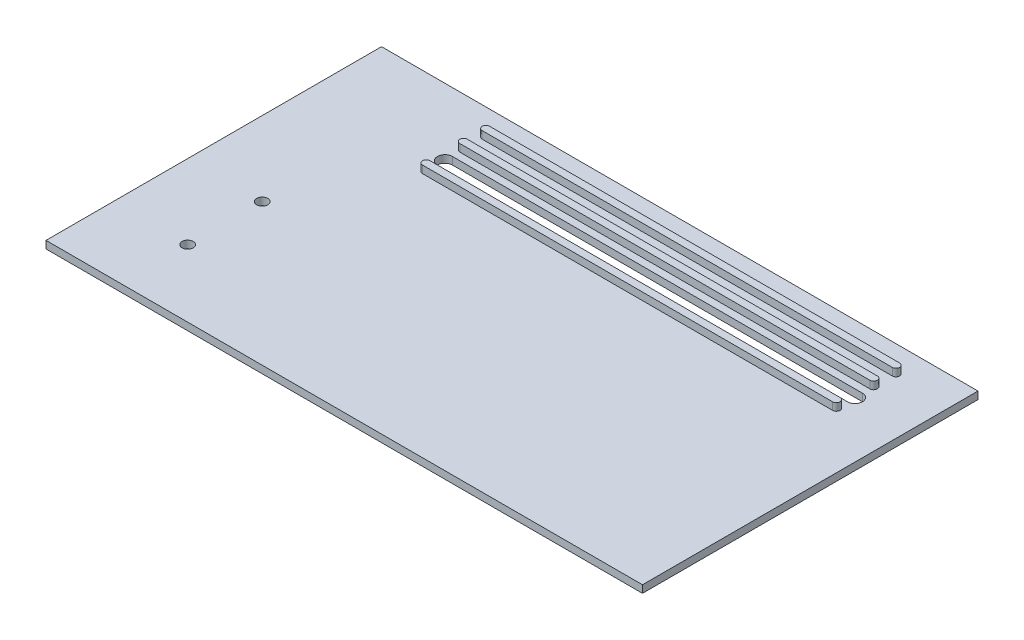
ISO-10303-21;
HEADER;
FILE_DESCRIPTION(('STEP AP214'),'2;1');
FILE_NAME('part.step','',(''),(''),'','','');
FILE_SCHEMA(('AUTOMOTIVE_DESIGN { 1 0 10303 214 1 1 1 1 }'));
ENDSEC;
DATA;
#1=APPLICATION_CONTEXT('core data for automotive mechanical design processes');
#2=APPLICATION_PROTOCOL_DEFINITION('international standard','automotive_design',2000,#1);
#3=PRODUCT_CONTEXT('',#1,'mechanical');
#4=PRODUCT('Part','Part','',(#3));
#5=PRODUCT_RELATED_PRODUCT_CATEGORY('part','',(#4));
#6=PRODUCT_DEFINITION_FORMATION('','',#4);
#7=PRODUCT_DEFINITION_CONTEXT('part definition',#1,'design');
#8=PRODUCT_DEFINITION('design','',#6,#7);
#9=PRODUCT_DEFINITION_SHAPE('','',#8);
#10=(LENGTH_UNIT() NAMED_UNIT(*) SI_UNIT(.MILLI.,.METRE.));
#11=(NAMED_UNIT(*) PLANE_ANGLE_UNIT() SI_UNIT($,.RADIAN.));
#12=(NAMED_UNIT(*) SI_UNIT($,.STERADIAN.) SOLID_ANGLE_UNIT());
#13=UNCERTAINTY_MEASURE_WITH_UNIT(LENGTH_MEASURE(1.E-05),#10,'distance_accuracy_value','');
#14=(GEOMETRIC_REPRESENTATION_CONTEXT(3) GLOBAL_UNCERTAINTY_ASSIGNED_CONTEXT((#13)) GLOBAL_UNIT_ASSIGNED_CONTEXT((#10,
#11,#12)) REPRESENTATION_CONTEXT('',''));
#15=CARTESIAN_POINT('',(0.,0.,0.));
#16=DIRECTION('',(0.,0.,1.));
#17=DIRECTION('',(1.,0.,0.));
#18=AXIS2_PLACEMENT_3D('',#15,#16,#17);
#19=CARTESIAN_POINT('',(0.,10.,0.));
#20=DIRECTION('',(0.,-1.,0.));
#21=DIRECTION('',(0.,0.,-1.));
#22=AXIS2_PLACEMENT_3D('',#19,#20,#21);
#23=PLANE('',#22);
#24=CARTESIAN_POINT('',(175.,10.,-335.));
#25=DIRECTION('',(0.,1.,0.));
#26=DIRECTION('',(0.,0.,1.));
#27=AXIS2_PLACEMENT_3D('',#24,#25,#26);
#28=CIRCLE('',#27,5.);
#29=CARTESIAN_POINT('',(175.,10.,-340.));
#30=VERTEX_POINT('',#29);
#31=CARTESIAN_POINT('',(175.,10.,-330.));
#32=VERTEX_POINT('',#31);
#33=EDGE_CURVE('E252',#30,#32,#28,.T.);
#34=ORIENTED_EDGE('',*,*,#33,.F.);
#35=DIRECTION('',(-1.,0.,0.));
#36=VECTOR('',#35,1.);
#37=CARTESIAN_POINT('',(175.,10.,-340.));
#38=LINE('',#37,#36);
#39=CARTESIAN_POINT('',(725.,10.,-340.));
#40=VERTEX_POINT('',#39);
#41=EDGE_CURVE('E239',#40,#30,#38,.T.);
#42=ORIENTED_EDGE('',*,*,#41,.F.);
#43=CARTESIAN_POINT('',(725.,10.,-335.));
#44=DIRECTION('',(0.,1.,0.));
#45=DIRECTION('',(0.,0.,1.));
#46=AXIS2_PLACEMENT_3D('',#43,#44,#45);
#47=CIRCLE('',#46,5.);
#48=CARTESIAN_POINT('',(725.,10.,-330.));
#49=VERTEX_POINT('',#48);
#50=EDGE_CURVE('E243',#49,#40,#47,.T.);
#51=ORIENTED_EDGE('',*,*,#50,.F.);
#52=DIRECTION('',(1.,0.,0.));
#53=VECTOR('',#52,1.);
#54=CARTESIAN_POINT('',(175.,10.,-330.));
#55=LINE('',#54,#53);
#56=EDGE_CURVE('E248',#32,#49,#55,.T.);
#57=ORIENTED_EDGE('',*,*,#56,.F.);
#58=EDGE_LOOP('',(#34,#42,#51,#57));
#59=FACE_BOUND('',#58,.T.);
#60=CARTESIAN_POINT('',(175.,10.,-360.));
#61=DIRECTION('',(0.,1.,0.));
#62=DIRECTION('',(0.,0.,1.));
#63=AXIS2_PLACEMENT_3D('',#60,#61,#62);
#64=CIRCLE('',#63,9.9999999999999);
#65=CARTESIAN_POINT('',(175.,10.,-370.));
#66=VERTEX_POINT('',#65);
#67=CARTESIAN_POINT('',(175.,10.,-350.));
#68=VERTEX_POINT('',#67);
#69=EDGE_CURVE('E313',#66,#68,#64,.T.);
#70=ORIENTED_EDGE('',*,*,#69,.F.);
#71=DIRECTION('',(-1.,0.,0.));
#72=VECTOR('',#71,1.);
#73=CARTESIAN_POINT('',(175.,10.,-370.));
#74=LINE('',#73,#72);
#75=CARTESIAN_POINT('',(725.,10.,-370.));
#76=VERTEX_POINT('',#75);
#77=EDGE_CURVE('E324',#76,#66,#74,.T.);
#78=ORIENTED_EDGE('',*,*,#77,.F.);
#79=CARTESIAN_POINT('',(725.,10.,-360.));
#80=DIRECTION('',(0.,1.,0.));
#81=DIRECTION('',(0.,0.,1.));
#82=AXIS2_PLACEMENT_3D('',#79,#80,#81);
#83=CIRCLE('',#82,9.9999999999999);
#84=CARTESIAN_POINT('',(725.,10.,-350.));
#85=VERTEX_POINT('',#84);
#86=EDGE_CURVE('E320',#85,#76,#83,.T.);
#87=ORIENTED_EDGE('',*,*,#86,.F.);
#88=DIRECTION('',(1.,0.,0.));
#89=VECTOR('',#88,1.);
#90=CARTESIAN_POINT('',(175.,10.,-350.));
#91=LINE('',#90,#89);
#92=EDGE_CURVE('E316',#68,#85,#91,.T.);
#93=ORIENTED_EDGE('',*,*,#92,.F.);
#94=EDGE_LOOP('',(#70,#78,#87,#93));
#95=FACE_BOUND('',#94,.T.);
#96=DIRECTION('',(0.,0.,1.));
#97=VECTOR('',#96,1.);
#98=CARTESIAN_POINT('',(0.,10.,0.));
#99=LINE('',#98,#97);
#100=CARTESIAN_POINT('',(-2.22044604925031E-13,10.,-450.));
#101=VERTEX_POINT('',#100);
#102=CARTESIAN_POINT('',(0.,10.,0.));
#103=VERTEX_POINT('',#102);
#104=EDGE_CURVE('E372',#101,#103,#99,.T.);
#105=ORIENTED_EDGE('',*,*,#104,.T.);
#106=DIRECTION('',(1.,0.,0.));
#107=VECTOR('',#106,1.);
#108=CARTESIAN_POINT('',(0.,10.,0.));
#109=LINE('',#108,#107);
#110=CARTESIAN_POINT('',(800.,10.,0.));
#111=VERTEX_POINT('',#110);
#112=EDGE_CURVE('E376',#103,#111,#109,.T.);
#113=ORIENTED_EDGE('',*,*,#112,.T.);
#114=DIRECTION('',(0.,0.,-1.));
#115=VECTOR('',#114,1.);
#116=CARTESIAN_POINT('',(800.,10.,0.));
#117=LINE('',#116,#115);
#118=CARTESIAN_POINT('',(800.,10.,-450.));
#119=VERTEX_POINT('',#118);
#120=EDGE_CURVE('E380',#111,#119,#117,.T.);
#121=ORIENTED_EDGE('',*,*,#120,.T.);
#122=DIRECTION('',(-1.,0.,0.));
#123=VECTOR('',#122,1.);
#124=CARTESIAN_POINT('',(-2.22044604925031E-13,10.,-450.));
#125=LINE('',#124,#123);
#126=EDGE_CURVE('E383',#119,#101,#125,.T.);
#127=ORIENTED_EDGE('',*,*,#126,.T.);
#128=EDGE_LOOP('',(#105,#113,#121,#127));
#129=FACE_BOUND('',#128,.T.);
#130=CARTESIAN_POINT('',(100.,10.,-190.));
#131=DIRECTION('',(0.,1.,0.));
#132=DIRECTION('',(0.,0.,1.));
#133=AXIS2_PLACEMENT_3D('',#130,#131,#132);
#134=CIRCLE('',#133,7.50000000000001);
#135=CARTESIAN_POINT('',(100.,10.,-182.5));
#136=VERTEX_POINT('',#135);
#137=EDGE_CURVE('E364',#136,#136,#134,.T.);
#138=ORIENTED_EDGE('',*,*,#137,.F.);
#139=EDGE_LOOP('',(#138));
#140=FACE_BOUND('',#139,.T.);
#141=CARTESIAN_POINT('',(100.,10.,-90.));
#142=DIRECTION('',(0.,1.,0.));
#143=DIRECTION('',(0.,0.,1.));
#144=AXIS2_PLACEMENT_3D('',#141,#142,#143);
#145=CIRCLE('',#144,7.50000000000001);
#146=CARTESIAN_POINT('',(100.,10.,-82.5));
#147=VERTEX_POINT('',#146);
#148=EDGE_CURVE('E356',#147,#147,#145,.T.);
#149=ORIENTED_EDGE('',*,*,#148,.F.);
#150=EDGE_LOOP('',(#149));
#151=FACE_BOUND('',#150,.T.);
#152=CARTESIAN_POINT('',(175.,10.,-385.));
#153=DIRECTION('',(0.,1.,0.));
#154=DIRECTION('',(0.,0.,1.));
#155=AXIS2_PLACEMENT_3D('',#152,#153,#154);
#156=CIRCLE('',#155,5.);
#157=CARTESIAN_POINT('',(175.,10.,-390.));
#158=VERTEX_POINT('',#157);
#159=CARTESIAN_POINT('',(175.,10.,-380.));
#160=VERTEX_POINT('',#159);
#161=EDGE_CURVE('E256',#158,#160,#156,.T.);
#162=ORIENTED_EDGE('',*,*,#161,.F.);
#163=DIRECTION('',(-1.,0.,0.));
#164=VECTOR('',#163,1.);
#165=CARTESIAN_POINT('',(175.,10.,-390.));
#166=LINE('',#165,#164);
#167=CARTESIAN_POINT('',(725.,10.,-390.));
#168=VERTEX_POINT('',#167);
#169=EDGE_CURVE('E273',#168,#158,#166,.T.);
#170=ORIENTED_EDGE('',*,*,#169,.F.);
#171=CARTESIAN_POINT('',(725.,10.,-385.));
#172=DIRECTION('',(0.,1.,0.));
#173=DIRECTION('',(0.,0.,1.));
#174=AXIS2_PLACEMENT_3D('',#171,#172,#173);
#175=CIRCLE('',#174,5.);
#176=CARTESIAN_POINT('',(725.,10.,-380.));
#177=VERTEX_POINT('',#176);
#178=EDGE_CURVE('E290',#177,#168,#175,.T.);
#179=ORIENTED_EDGE('',*,*,#178,.F.);
#180=DIRECTION('',(1.,0.,0.));
#181=VECTOR('',#180,1.);
#182=CARTESIAN_POINT('',(175.,10.,-380.));
#183=LINE('',#182,#181);
#184=EDGE_CURVE('E286',#160,#177,#183,.T.);
#185=ORIENTED_EDGE('',*,*,#184,.F.);
#186=EDGE_LOOP('',(#162,#170,#179,#185));
#187=FACE_BOUND('',#186,.T.);
#188=CARTESIAN_POINT('',(175.,10.,-415.));
#189=DIRECTION('',(0.,1.,0.));
#190=DIRECTION('',(0.,0.,1.));
#191=AXIS2_PLACEMENT_3D('',#188,#189,#190);
#192=CIRCLE('',#191,5.);
#193=CARTESIAN_POINT('',(175.,10.,-420.));
#194=VERTEX_POINT('',#193);
#195=CARTESIAN_POINT('',(175.,10.,-410.));
#196=VERTEX_POINT('',#195);
#197=EDGE_CURVE('E178',#194,#196,#192,.T.);
#198=ORIENTED_EDGE('',*,*,#197,.F.);
#199=DIRECTION('',(-1.,0.,0.));
#200=VECTOR('',#199,1.);
#201=CARTESIAN_POINT('',(175.,10.,-420.));
#202=LINE('',#201,#200);
#203=CARTESIAN_POINT('',(725.,10.,-420.));
#204=VERTEX_POINT('',#203);
#205=EDGE_CURVE('E180',#204,#194,#202,.T.);
#206=ORIENTED_EDGE('',*,*,#205,.F.);
#207=CARTESIAN_POINT('',(725.,10.,-415.));
#208=DIRECTION('',(0.,1.,0.));
#209=DIRECTION('',(0.,0.,1.));
#210=AXIS2_PLACEMENT_3D('',#207,#208,#209);
#211=CIRCLE('',#210,5.);
#212=CARTESIAN_POINT('',(725.,10.,-410.));
#213=VERTEX_POINT('',#212);
#214=EDGE_CURVE('E65',#213,#204,#211,.T.);
#215=ORIENTED_EDGE('',*,*,#214,.F.);
#216=DIRECTION('',(1.,0.,0.));
#217=VECTOR('',#216,1.);
#218=CARTESIAN_POINT('',(175.,10.,-410.));
#219=LINE('',#218,#217);
#220=EDGE_CURVE('E60',#196,#213,#219,.T.);
#221=ORIENTED_EDGE('',*,*,#220,.F.);
#222=EDGE_LOOP('',(#198,#206,#215,#221));
#223=FACE_BOUND('',#222,.T.);
#224=ADVANCED_FACE('F44',(#59,#95,#129,#140,#151,#187,#223),#23,.F.);
#225=CARTESIAN_POINT('',(0.,0.,0.));
#226=DIRECTION('',(0.,-1.,0.));
#227=DIRECTION('',(0.,0.,-1.));
#228=AXIS2_PLACEMENT_3D('',#225,#226,#227);
#229=PLANE('',#228);
#230=CARTESIAN_POINT('',(100.,0.,-190.));
#231=DIRECTION('',(0.,1.,0.));
#232=DIRECTION('',(0.,0.,1.));
#233=AXIS2_PLACEMENT_3D('',#230,#231,#232);
#234=CIRCLE('',#233,7.50000000000001);
#235=CARTESIAN_POINT('',(100.,0.,-182.5));
#236=VERTEX_POINT('',#235);
#237=EDGE_CURVE('E360',#236,#236,#234,.T.);
#238=ORIENTED_EDGE('',*,*,#237,.T.);
#239=EDGE_LOOP('',(#238));
#240=FACE_BOUND('',#239,.T.);
#241=DIRECTION('',(0.,0.,1.));
#242=VECTOR('',#241,1.);
#243=CARTESIAN_POINT('',(0.,0.,0.));
#244=LINE('',#243,#242);
#245=CARTESIAN_POINT('',(-2.22044604925031E-13,0.,-450.));
#246=VERTEX_POINT('',#245);
#247=CARTESIAN_POINT('',(0.,0.,0.));
#248=VERTEX_POINT('',#247);
#249=EDGE_CURVE('E368',#246,#248,#244,.T.);
#250=ORIENTED_EDGE('',*,*,#249,.F.);
#251=DIRECTION('',(-1.,0.,0.));
#252=VECTOR('',#251,1.);
#253=CARTESIAN_POINT('',(-2.22044604925031E-13,0.,-450.));
#254=LINE('',#253,#252);
#255=CARTESIAN_POINT('',(800.,0.,-450.));
#256=VERTEX_POINT('',#255);
#257=EDGE_CURVE('E377',#256,#246,#254,.T.);
#258=ORIENTED_EDGE('',*,*,#257,.F.);
#259=DIRECTION('',(0.,0.,-1.));
#260=VECTOR('',#259,1.);
#261=CARTESIAN_POINT('',(800.,0.,0.));
#262=LINE('',#261,#260);
#263=CARTESIAN_POINT('',(800.,0.,0.));
#264=VERTEX_POINT('',#263);
#265=EDGE_CURVE('E393',#264,#256,#262,.T.);
#266=ORIENTED_EDGE('',*,*,#265,.F.);
#267=DIRECTION('',(1.,0.,0.));
#268=VECTOR('',#267,1.);
#269=CARTESIAN_POINT('',(0.,0.,0.));
#270=LINE('',#269,#268);
#271=EDGE_CURVE('E390',#248,#264,#270,.T.);
#272=ORIENTED_EDGE('',*,*,#271,.F.);
#273=EDGE_LOOP('',(#250,#258,#266,#272));
#274=FACE_BOUND('',#273,.T.);
#275=CARTESIAN_POINT('',(100.,0.,-90.));
#276=DIRECTION('',(0.,1.,0.));
#277=DIRECTION('',(0.,0.,1.));
#278=AXIS2_PLACEMENT_3D('',#275,#276,#277);
#279=CIRCLE('',#278,7.50000000000001);
#280=CARTESIAN_POINT('',(100.,0.,-82.5));
#281=VERTEX_POINT('',#280);
#282=EDGE_CURVE('E355',#281,#281,#279,.T.);
#283=ORIENTED_EDGE('',*,*,#282,.T.);
#284=EDGE_LOOP('',(#283));
#285=FACE_BOUND('',#284,.T.);
#286=DIRECTION('',(-1.,0.,0.));
#287=VECTOR('',#286,1.);
#288=CARTESIAN_POINT('',(175.,0.,-370.));
#289=LINE('',#288,#287);
#290=CARTESIAN_POINT('',(725.,0.,-370.));
#291=VERTEX_POINT('',#290);
#292=CARTESIAN_POINT('',(175.,0.,-370.));
#293=VERTEX_POINT('',#292);
#294=EDGE_CURVE('E317',#291,#293,#289,.T.);
#295=ORIENTED_EDGE('',*,*,#294,.T.);
#296=CARTESIAN_POINT('',(175.,0.,-360.));
#297=DIRECTION('',(0.,1.,0.));
#298=DIRECTION('',(0.,0.,1.));
#299=AXIS2_PLACEMENT_3D('',#296,#297,#298);
#300=CIRCLE('',#299,9.9999999999999);
#301=CARTESIAN_POINT('',(175.,0.,-350.));
#302=VERTEX_POINT('',#301);
#303=EDGE_CURVE('E312',#293,#302,#300,.T.);
#304=ORIENTED_EDGE('',*,*,#303,.T.);
#305=DIRECTION('',(1.,0.,0.));
#306=VECTOR('',#305,1.);
#307=CARTESIAN_POINT('',(175.,0.,-350.));
#308=LINE('',#307,#306);
#309=CARTESIAN_POINT('',(725.,0.,-350.));
#310=VERTEX_POINT('',#309);
#311=EDGE_CURVE('E331',#302,#310,#308,.T.);
#312=ORIENTED_EDGE('',*,*,#311,.T.);
#313=CARTESIAN_POINT('',(725.,0.,-360.));
#314=DIRECTION('',(0.,1.,0.));
#315=DIRECTION('',(0.,0.,1.));
#316=AXIS2_PLACEMENT_3D('',#313,#314,#315);
#317=CIRCLE('',#316,9.9999999999999);
#318=EDGE_CURVE('E335',#310,#291,#317,.T.);
#319=ORIENTED_EDGE('',*,*,#318,.T.);
#320=EDGE_LOOP('',(#295,#304,#312,#319));
#321=FACE_BOUND('',#320,.T.);
#322=ADVANCED_FACE('F416',(#240,#274,#285,#321),#229,.T.);
#323=CARTESIAN_POINT('',(0.,10.,0.));
#324=DIRECTION('',(1.,0.,0.));
#325=DIRECTION('',(0.,0.,-1.));
#326=AXIS2_PLACEMENT_3D('',#323,#324,#325);
#327=PLANE('',#326);
#328=ORIENTED_EDGE('',*,*,#249,.T.);
#329=DIRECTION('',(0.,-1.,0.));
#330=VECTOR('',#329,1.);
#331=CARTESIAN_POINT('',(0.,10.,0.));
#332=LINE('',#331,#330);
#333=EDGE_CURVE('E11',#103,#248,#332,.T.);
#334=ORIENTED_EDGE('',*,*,#333,.F.);
#335=ORIENTED_EDGE('',*,*,#104,.F.);
#336=DIRECTION('',(0.,-1.,0.));
#337=VECTOR('',#336,1.);
#338=CARTESIAN_POINT('',(-2.22044604925031E-13,10.,-450.));
#339=LINE('',#338,#337);
#340=EDGE_CURVE('E386',#101,#246,#339,.T.);
#341=ORIENTED_EDGE('',*,*,#340,.T.);
#342=EDGE_LOOP('',(#328,#334,#335,#341));
#343=FACE_BOUND('',#342,.T.);
#344=ADVANCED_FACE('F46',(#343),#327,.F.);
#345=CARTESIAN_POINT('',(0.,10.,0.));
#346=DIRECTION('',(0.,0.,-1.));
#347=DIRECTION('',(-1.,0.,0.));
#348=AXIS2_PLACEMENT_3D('',#345,#346,#347);
#349=PLANE('',#348);
#350=ORIENTED_EDGE('',*,*,#271,.T.);
#351=DIRECTION('',(0.,-1.,0.));
#352=VECTOR('',#351,1.);
#353=CARTESIAN_POINT('',(800.,10.,0.));
#354=LINE('',#353,#352);
#355=EDGE_CURVE('E53',#111,#264,#354,.T.);
#356=ORIENTED_EDGE('',*,*,#355,.F.);
#357=ORIENTED_EDGE('',*,*,#112,.F.);
#358=ORIENTED_EDGE('',*,*,#333,.T.);
#359=EDGE_LOOP('',(#350,#356,#357,#358));
#360=FACE_BOUND('',#359,.T.);
#361=ADVANCED_FACE('F427',(#360),#349,.F.);
#362=CARTESIAN_POINT('',(800.,10.,0.));
#363=DIRECTION('',(-1.,0.,0.));
#364=DIRECTION('',(0.,0.,1.));
#365=AXIS2_PLACEMENT_3D('',#362,#363,#364);
#366=PLANE('',#365);
#367=ORIENTED_EDGE('',*,*,#265,.T.);
#368=DIRECTION('',(0.,-1.,0.));
#369=VECTOR('',#368,1.);
#370=CARTESIAN_POINT('',(800.,10.,-450.));
#371=LINE('',#370,#369);
#372=EDGE_CURVE('E401',#119,#256,#371,.T.);
#373=ORIENTED_EDGE('',*,*,#372,.F.);
#374=ORIENTED_EDGE('',*,*,#120,.F.);
#375=ORIENTED_EDGE('',*,*,#355,.T.);
#376=EDGE_LOOP('',(#367,#373,#374,#375));
#377=FACE_BOUND('',#376,.T.);
#378=ADVANCED_FACE('F410',(#377),#366,.F.);
#379=CARTESIAN_POINT('',(-2.22044604925031E-13,10.,-450.));
#380=DIRECTION('',(0.,0.,1.));
#381=DIRECTION('',(1.,0.,0.));
#382=AXIS2_PLACEMENT_3D('',#379,#380,#381);
#383=PLANE('',#382);
#384=ORIENTED_EDGE('',*,*,#257,.T.);
#385=ORIENTED_EDGE('',*,*,#340,.F.);
#386=ORIENTED_EDGE('',*,*,#126,.F.);
#387=ORIENTED_EDGE('',*,*,#372,.T.);
#388=EDGE_LOOP('',(#384,#385,#386,#387));
#389=FACE_BOUND('',#388,.T.);
#390=ADVANCED_FACE('F420',(#389),#383,.F.);
#391=CARTESIAN_POINT('',(100.,10.,-190.));
#392=DIRECTION('',(0.,-1.,0.));
#393=DIRECTION('',(0.,0.,-1.));
#394=AXIS2_PLACEMENT_3D('',#391,#392,#393);
#395=CYLINDRICAL_SURFACE('',#394,7.50000000000001);
#396=ORIENTED_EDGE('',*,*,#137,.T.);
#397=EDGE_LOOP('',(#396));
#398=FACE_BOUND('',#397,.T.);
#399=ORIENTED_EDGE('',*,*,#237,.F.);
#400=EDGE_LOOP('',(#399));
#401=FACE_BOUND('',#400,.T.);
#402=ADVANCED_FACE('F444',(#398,#401),#395,.F.);
#403=CARTESIAN_POINT('',(100.,10.,-90.));
#404=DIRECTION('',(0.,-1.,0.));
#405=DIRECTION('',(0.,0.,-1.));
#406=AXIS2_PLACEMENT_3D('',#403,#404,#405);
#407=CYLINDRICAL_SURFACE('',#406,7.50000000000001);
#408=ORIENTED_EDGE('',*,*,#148,.T.);
#409=EDGE_LOOP('',(#408));
#410=FACE_BOUND('',#409,.T.);
#411=ORIENTED_EDGE('',*,*,#282,.F.);
#412=EDGE_LOOP('',(#411));
#413=FACE_BOUND('',#412,.T.);
#414=ADVANCED_FACE('F451',(#410,#413),#407,.F.);
#415=CARTESIAN_POINT('',(175.,10.,-360.));
#416=DIRECTION('',(0.,-1.,0.));
#417=DIRECTION('',(0.,0.,-1.));
#418=AXIS2_PLACEMENT_3D('',#415,#416,#417);
#419=CYLINDRICAL_SURFACE('',#418,9.9999999999999);
#420=ORIENTED_EDGE('',*,*,#303,.F.);
#421=DIRECTION('',(0.,-1.,0.));
#422=VECTOR('',#421,1.);
#423=CARTESIAN_POINT('',(175.,10.,-370.));
#424=LINE('',#423,#422);
#425=EDGE_CURVE('E327',#66,#293,#424,.T.);
#426=ORIENTED_EDGE('',*,*,#425,.F.);
#427=ORIENTED_EDGE('',*,*,#69,.T.);
#428=DIRECTION('',(0.,-1.,0.));
#429=VECTOR('',#428,1.);
#430=CARTESIAN_POINT('',(175.,10.,-350.));
#431=LINE('',#430,#429);
#432=EDGE_CURVE('E351',#68,#302,#431,.T.);
#433=ORIENTED_EDGE('',*,*,#432,.T.);
#434=EDGE_LOOP('',(#420,#426,#427,#433));
#435=FACE_BOUND('',#434,.T.);
#436=ADVANCED_FACE('F456',(#435),#419,.F.);
#437=CARTESIAN_POINT('',(175.,10.,-350.));
#438=DIRECTION('',(0.,0.,-1.));
#439=DIRECTION('',(-1.,0.,0.));
#440=AXIS2_PLACEMENT_3D('',#437,#438,#439);
#441=PLANE('',#440);
#442=ORIENTED_EDGE('',*,*,#311,.F.);
#443=ORIENTED_EDGE('',*,*,#432,.F.);
#444=ORIENTED_EDGE('',*,*,#92,.T.);
#445=DIRECTION('',(0.,-1.,0.));
#446=VECTOR('',#445,1.);
#447=CARTESIAN_POINT('',(725.,10.,-350.));
#448=LINE('',#447,#446);
#449=EDGE_CURVE('E348',#85,#310,#448,.T.);
#450=ORIENTED_EDGE('',*,*,#449,.T.);
#451=EDGE_LOOP('',(#442,#443,#444,#450));
#452=FACE_BOUND('',#451,.T.);
#453=ADVANCED_FACE('F498',(#452),#441,.T.);
#454=CARTESIAN_POINT('',(725.,10.,-360.));
#455=DIRECTION('',(0.,-1.,0.));
#456=DIRECTION('',(0.,0.,-1.));
#457=AXIS2_PLACEMENT_3D('',#454,#455,#456);
#458=CYLINDRICAL_SURFACE('',#457,9.9999999999999);
#459=ORIENTED_EDGE('',*,*,#318,.F.);
#460=ORIENTED_EDGE('',*,*,#449,.F.);
#461=ORIENTED_EDGE('',*,*,#86,.T.);
#462=DIRECTION('',(0.,-1.,0.));
#463=VECTOR('',#462,1.);
#464=CARTESIAN_POINT('',(725.,10.,-370.));
#465=LINE('',#464,#463);
#466=EDGE_CURVE('E345',#76,#291,#465,.T.);
#467=ORIENTED_EDGE('',*,*,#466,.T.);
#468=EDGE_LOOP('',(#459,#460,#461,#467));
#469=FACE_BOUND('',#468,.T.);
#470=ADVANCED_FACE('F494',(#469),#458,.F.);
#471=CARTESIAN_POINT('',(175.,10.,-370.));
#472=DIRECTION('',(0.,0.,1.));
#473=DIRECTION('',(1.,0.,0.));
#474=AXIS2_PLACEMENT_3D('',#471,#472,#473);
#475=PLANE('',#474);
#476=ORIENTED_EDGE('',*,*,#294,.F.);
#477=ORIENTED_EDGE('',*,*,#466,.F.);
#478=ORIENTED_EDGE('',*,*,#77,.T.);
#479=ORIENTED_EDGE('',*,*,#425,.T.);
#480=EDGE_LOOP('',(#476,#477,#478,#479));
#481=FACE_BOUND('',#480,.T.);
#482=ADVANCED_FACE('F488',(#481),#475,.T.);
#483=CARTESIAN_POINT('',(175.,20.,-385.));
#484=DIRECTION('',(0.,-1.,0.));
#485=DIRECTION('',(0.,0.,-1.));
#486=AXIS2_PLACEMENT_3D('',#483,#484,#485);
#487=CYLINDRICAL_SURFACE('',#486,5.);
#488=ORIENTED_EDGE('',*,*,#161,.T.);
#489=DIRECTION('',(0.,-1.,0.));
#490=VECTOR('',#489,1.);
#491=CARTESIAN_POINT('',(175.,20.,-380.));
#492=LINE('',#491,#490);
#493=CARTESIAN_POINT('',(175.,20.,-380.));
#494=VERTEX_POINT('',#493);
#495=EDGE_CURVE('E308',#494,#160,#492,.T.);
#496=ORIENTED_EDGE('',*,*,#495,.F.);
#497=CARTESIAN_POINT('',(175.,20.,-385.));
#498=DIRECTION('',(0.,1.,0.));
#499=DIRECTION('',(0.,0.,1.));
#500=AXIS2_PLACEMENT_3D('',#497,#498,#499);
#501=CIRCLE('',#500,5.);
#502=CARTESIAN_POINT('',(175.,20.,-390.));
#503=VERTEX_POINT('',#502);
#504=EDGE_CURVE('E268',#503,#494,#501,.T.);
#505=ORIENTED_EDGE('',*,*,#504,.F.);
#506=DIRECTION('',(0.,-1.,0.));
#507=VECTOR('',#506,1.);
#508=CARTESIAN_POINT('',(175.,20.,-390.));
#509=LINE('',#508,#507);
#510=EDGE_CURVE('E282',#503,#158,#509,.T.);
#511=ORIENTED_EDGE('',*,*,#510,.T.);
#512=EDGE_LOOP('',(#488,#496,#505,#511));
#513=FACE_BOUND('',#512,.T.);
#514=ADVANCED_FACE('F472',(#513),#487,.T.);
#515=CARTESIAN_POINT('',(175.,20.,-380.));
#516=DIRECTION('',(0.,0.,-1.));
#517=DIRECTION('',(-1.,0.,0.));
#518=AXIS2_PLACEMENT_3D('',#515,#516,#517);
#519=PLANE('',#518);
#520=ORIENTED_EDGE('',*,*,#184,.T.);
#521=DIRECTION('',(0.,-1.,0.));
#522=VECTOR('',#521,1.);
#523=CARTESIAN_POINT('',(725.,20.,-380.));
#524=LINE('',#523,#522);
#525=CARTESIAN_POINT('',(725.,20.,-380.));
#526=VERTEX_POINT('',#525);
#527=EDGE_CURVE('E304',#526,#177,#524,.T.);
#528=ORIENTED_EDGE('',*,*,#527,.F.);
#529=DIRECTION('',(1.,0.,0.));
#530=VECTOR('',#529,1.);
#531=CARTESIAN_POINT('',(175.,20.,-380.));
#532=LINE('',#531,#530);
#533=EDGE_CURVE('E272',#494,#526,#532,.T.);
#534=ORIENTED_EDGE('',*,*,#533,.F.);
#535=ORIENTED_EDGE('',*,*,#495,.T.);
#536=EDGE_LOOP('',(#520,#528,#534,#535));
#537=FACE_BOUND('',#536,.T.);
#538=ADVANCED_FACE('F480',(#537),#519,.F.);
#539=CARTESIAN_POINT('',(725.,20.,-385.));
#540=DIRECTION('',(0.,-1.,0.));
#541=DIRECTION('',(0.,0.,-1.));
#542=AXIS2_PLACEMENT_3D('',#539,#540,#541);
#543=CYLINDRICAL_SURFACE('',#542,5.);
#544=ORIENTED_EDGE('',*,*,#178,.T.);
#545=DIRECTION('',(0.,-1.,0.));
#546=VECTOR('',#545,1.);
#547=CARTESIAN_POINT('',(725.,20.,-390.));
#548=LINE('',#547,#546);
#549=CARTESIAN_POINT('',(725.,20.,-390.));
#550=VERTEX_POINT('',#549);
#551=EDGE_CURVE('E300',#550,#168,#548,.T.);
#552=ORIENTED_EDGE('',*,*,#551,.F.);
#553=CARTESIAN_POINT('',(725.,20.,-385.));
#554=DIRECTION('',(0.,1.,0.));
#555=DIRECTION('',(0.,0.,1.));
#556=AXIS2_PLACEMENT_3D('',#553,#554,#555);
#557=CIRCLE('',#556,5.);
#558=EDGE_CURVE('E276',#526,#550,#557,.T.);
#559=ORIENTED_EDGE('',*,*,#558,.F.);
#560=ORIENTED_EDGE('',*,*,#527,.T.);
#561=EDGE_LOOP('',(#544,#552,#559,#560));
#562=FACE_BOUND('',#561,.T.);
#563=ADVANCED_FACE('F478',(#562),#543,.T.);
#564=CARTESIAN_POINT('',(175.,20.,-390.));
#565=DIRECTION('',(0.,0.,1.));
#566=DIRECTION('',(1.,0.,0.));
#567=AXIS2_PLACEMENT_3D('',#564,#565,#566);
#568=PLANE('',#567);
#569=ORIENTED_EDGE('',*,*,#169,.T.);
#570=ORIENTED_EDGE('',*,*,#510,.F.);
#571=DIRECTION('',(-1.,0.,0.));
#572=VECTOR('',#571,1.);
#573=CARTESIAN_POINT('',(175.,20.,-390.));
#574=LINE('',#573,#572);
#575=EDGE_CURVE('E279',#550,#503,#574,.T.);
#576=ORIENTED_EDGE('',*,*,#575,.F.);
#577=ORIENTED_EDGE('',*,*,#551,.T.);
#578=EDGE_LOOP('',(#569,#570,#576,#577));
#579=FACE_BOUND('',#578,.T.);
#580=ADVANCED_FACE('F468',(#579),#568,.F.);
#581=CARTESIAN_POINT('',(175.,20.,-385.));
#582=DIRECTION('',(0.,1.,0.));
#583=DIRECTION('',(0.,0.,1.));
#584=AXIS2_PLACEMENT_3D('',#581,#582,#583);
#585=PLANE('',#584);
#586=ORIENTED_EDGE('',*,*,#504,.T.);
#587=ORIENTED_EDGE('',*,*,#533,.T.);
#588=ORIENTED_EDGE('',*,*,#558,.T.);
#589=ORIENTED_EDGE('',*,*,#575,.T.);
#590=EDGE_LOOP('',(#586,#587,#588,#589));
#591=FACE_BOUND('',#590,.T.);
#592=ADVANCED_FACE('F474',(#591),#585,.T.);
#593=CARTESIAN_POINT('',(175.,20.,-335.));
#594=DIRECTION('',(0.,-1.,0.));
#595=DIRECTION('',(0.,0.,-1.));
#596=AXIS2_PLACEMENT_3D('',#593,#594,#595);
#597=CYLINDRICAL_SURFACE('',#596,5.);
#598=ORIENTED_EDGE('',*,*,#33,.T.);
#599=DIRECTION('',(0.,-1.,0.));
#600=VECTOR('',#599,1.);
#601=CARTESIAN_POINT('',(175.,20.,-330.));
#602=LINE('',#601,#600);
#603=CARTESIAN_POINT('',(175.,20.,-330.));
#604=VERTEX_POINT('',#603);
#605=EDGE_CURVE('E185',#604,#32,#602,.T.);
#606=ORIENTED_EDGE('',*,*,#605,.F.);
#607=CARTESIAN_POINT('',(175.,20.,-335.));
#608=DIRECTION('',(0.,1.,0.));
#609=DIRECTION('',(0.,0.,1.));
#610=AXIS2_PLACEMENT_3D('',#607,#608,#609);
#611=CIRCLE('',#610,5.);
#612=CARTESIAN_POINT('',(175.,20.,-340.));
#613=VERTEX_POINT('',#612);
#614=EDGE_CURVE('E244',#613,#604,#611,.T.);
#615=ORIENTED_EDGE('',*,*,#614,.F.);
#616=DIRECTION('',(0.,-1.,0.));
#617=VECTOR('',#616,1.);
#618=CARTESIAN_POINT('',(175.,20.,-340.));
#619=LINE('',#618,#617);
#620=EDGE_CURVE('E234',#613,#30,#619,.T.);
#621=ORIENTED_EDGE('',*,*,#620,.T.);
#622=EDGE_LOOP('',(#598,#606,#615,#621));
#623=FACE_BOUND('',#622,.T.);
#624=ADVANCED_FACE('F568',(#623),#597,.T.);
#625=CARTESIAN_POINT('',(175.,20.,-330.));
#626=DIRECTION('',(0.,0.,-1.));
#627=DIRECTION('',(-1.,0.,0.));
#628=AXIS2_PLACEMENT_3D('',#625,#626,#627);
#629=PLANE('',#628);
#630=ORIENTED_EDGE('',*,*,#56,.T.);
#631=DIRECTION('',(0.,-1.,0.));
#632=VECTOR('',#631,1.);
#633=CARTESIAN_POINT('',(725.,20.,-330.));
#634=LINE('',#633,#632);
#635=CARTESIAN_POINT('',(725.,20.,-330.));
#636=VERTEX_POINT('',#635);
#637=EDGE_CURVE('E226',#636,#49,#634,.T.);
#638=ORIENTED_EDGE('',*,*,#637,.F.);
#639=DIRECTION('',(1.,0.,0.));
#640=VECTOR('',#639,1.);
#641=CARTESIAN_POINT('',(175.,20.,-330.));
#642=LINE('',#641,#640);
#643=EDGE_CURVE('E262',#604,#636,#642,.T.);
#644=ORIENTED_EDGE('',*,*,#643,.F.);
#645=ORIENTED_EDGE('',*,*,#605,.T.);
#646=EDGE_LOOP('',(#630,#638,#644,#645));
#647=FACE_BOUND('',#646,.T.);
#648=ADVANCED_FACE('F578',(#647),#629,.F.);
#649=CARTESIAN_POINT('',(725.,20.,-335.));
#650=DIRECTION('',(0.,-1.,0.));
#651=DIRECTION('',(0.,0.,-1.));
#652=AXIS2_PLACEMENT_3D('',#649,#650,#651);
#653=CYLINDRICAL_SURFACE('',#652,5.);
#654=ORIENTED_EDGE('',*,*,#50,.T.);
#655=DIRECTION('',(0.,-1.,0.));
#656=VECTOR('',#655,1.);
#657=CARTESIAN_POINT('',(725.,20.,-340.));
#658=LINE('',#657,#656);
#659=CARTESIAN_POINT('',(725.,20.,-340.));
#660=VERTEX_POINT('',#659);
#661=EDGE_CURVE('E230',#660,#40,#658,.T.);
#662=ORIENTED_EDGE('',*,*,#661,.F.);
#663=CARTESIAN_POINT('',(725.,20.,-335.));
#664=DIRECTION('',(0.,1.,0.));
#665=DIRECTION('',(0.,0.,1.));
#666=AXIS2_PLACEMENT_3D('',#663,#664,#665);
#667=CIRCLE('',#666,5.);
#668=EDGE_CURVE('E259',#636,#660,#667,.T.);
#669=ORIENTED_EDGE('',*,*,#668,.F.);
#670=ORIENTED_EDGE('',*,*,#637,.T.);
#671=EDGE_LOOP('',(#654,#662,#669,#670));
#672=FACE_BOUND('',#671,.T.);
#673=ADVANCED_FACE('F589',(#672),#653,.T.);
#674=CARTESIAN_POINT('',(175.,20.,-340.));
#675=DIRECTION('',(0.,0.,1.));
#676=DIRECTION('',(1.,0.,0.));
#677=AXIS2_PLACEMENT_3D('',#674,#675,#676);
#678=PLANE('',#677);
#679=ORIENTED_EDGE('',*,*,#41,.T.);
#680=ORIENTED_EDGE('',*,*,#620,.F.);
#681=DIRECTION('',(-1.,0.,0.));
#682=VECTOR('',#681,1.);
#683=CARTESIAN_POINT('',(175.,20.,-340.));
#684=LINE('',#683,#682);
#685=EDGE_CURVE('E238',#660,#613,#684,.T.);
#686=ORIENTED_EDGE('',*,*,#685,.F.);
#687=ORIENTED_EDGE('',*,*,#661,.T.);
#688=EDGE_LOOP('',(#679,#680,#686,#687));
#689=FACE_BOUND('',#688,.T.);
#690=ADVANCED_FACE('F600',(#689),#678,.F.);
#691=CARTESIAN_POINT('',(175.,20.,-335.));
#692=DIRECTION('',(0.,1.,0.));
#693=DIRECTION('',(0.,0.,1.));
#694=AXIS2_PLACEMENT_3D('',#691,#692,#693);
#695=PLANE('',#694);
#696=ORIENTED_EDGE('',*,*,#614,.T.);
#697=ORIENTED_EDGE('',*,*,#643,.T.);
#698=ORIENTED_EDGE('',*,*,#668,.T.);
#699=ORIENTED_EDGE('',*,*,#685,.T.);
#700=EDGE_LOOP('',(#696,#697,#698,#699));
#701=FACE_BOUND('',#700,.T.);
#702=ADVANCED_FACE('F611',(#701),#695,.T.);
#703=CARTESIAN_POINT('',(175.,20.,-415.));
#704=DIRECTION('',(0.,-1.,0.));
#705=DIRECTION('',(0.,0.,-1.));
#706=AXIS2_PLACEMENT_3D('',#703,#704,#705);
#707=CYLINDRICAL_SURFACE('',#706,5.);
#708=ORIENTED_EDGE('',*,*,#197,.T.);
#709=DIRECTION('',(0.,-1.,0.));
#710=VECTOR('',#709,1.);
#711=CARTESIAN_POINT('',(175.,20.,-410.));
#712=LINE('',#711,#710);
#713=CARTESIAN_POINT('',(175.,20.,-410.));
#714=VERTEX_POINT('',#713);
#715=EDGE_CURVE('E761',#714,#196,#712,.T.);
#716=ORIENTED_EDGE('',*,*,#715,.F.);
#717=CARTESIAN_POINT('',(175.,20.,-415.));
#718=DIRECTION('',(0.,1.,0.));
#719=DIRECTION('',(0.,0.,1.));
#720=AXIS2_PLACEMENT_3D('',#717,#718,#719);
#721=CIRCLE('',#720,5.);
#722=CARTESIAN_POINT('',(175.,20.,-420.));
#723=VERTEX_POINT('',#722);
#724=EDGE_CURVE('E197',#723,#714,#721,.T.);
#725=ORIENTED_EDGE('',*,*,#724,.F.);
#726=DIRECTION('',(0.,-1.,0.));
#727=VECTOR('',#726,1.);
#728=CARTESIAN_POINT('',(175.,20.,-420.));
#729=LINE('',#728,#727);
#730=EDGE_CURVE('E192',#723,#194,#729,.T.);
#731=ORIENTED_EDGE('',*,*,#730,.T.);
#732=EDGE_LOOP('',(#708,#716,#725,#731));
#733=FACE_BOUND('',#732,.T.);
#734=ADVANCED_FACE('F199',(#733),#707,.T.);
#735=CARTESIAN_POINT('',(175.,20.,-410.));
#736=DIRECTION('',(0.,0.,-1.));
#737=DIRECTION('',(-1.,0.,0.));
#738=AXIS2_PLACEMENT_3D('',#735,#736,#737);
#739=PLANE('',#738);
#740=ORIENTED_EDGE('',*,*,#220,.T.);
#741=DIRECTION('',(0.,-1.,0.));
#742=VECTOR('',#741,1.);
#743=CARTESIAN_POINT('',(725.,20.,-410.));
#744=LINE('',#743,#742);
#745=CARTESIAN_POINT('',(725.,20.,-410.));
#746=VERTEX_POINT('',#745);
#747=EDGE_CURVE('E208',#746,#213,#744,.T.);
#748=ORIENTED_EDGE('',*,*,#747,.F.);
#749=DIRECTION('',(1.,0.,0.));
#750=VECTOR('',#749,1.);
#751=CARTESIAN_POINT('',(175.,20.,-410.));
#752=LINE('',#751,#750);
#753=EDGE_CURVE('E218',#714,#746,#752,.T.);
#754=ORIENTED_EDGE('',*,*,#753,.F.);
#755=ORIENTED_EDGE('',*,*,#715,.T.);
#756=EDGE_LOOP('',(#740,#748,#754,#755));
#757=FACE_BOUND('',#756,.T.);
#758=ADVANCED_FACE('F632',(#757),#739,.F.);
#759=CARTESIAN_POINT('',(725.,20.,-415.));
#760=DIRECTION('',(0.,-1.,0.));
#761=DIRECTION('',(0.,0.,-1.));
#762=AXIS2_PLACEMENT_3D('',#759,#760,#761);
#763=CYLINDRICAL_SURFACE('',#762,5.);
#764=ORIENTED_EDGE('',*,*,#214,.T.);
#765=DIRECTION('',(0.,-1.,0.));
#766=VECTOR('',#765,1.);
#767=CARTESIAN_POINT('',(725.,20.,-420.));
#768=LINE('',#767,#766);
#769=CARTESIAN_POINT('',(725.,20.,-420.));
#770=VERTEX_POINT('',#769);
#771=EDGE_CURVE('E195',#770,#204,#768,.T.);
#772=ORIENTED_EDGE('',*,*,#771,.F.);
#773=CARTESIAN_POINT('',(725.,20.,-415.));
#774=DIRECTION('',(0.,1.,0.));
#775=DIRECTION('',(0.,0.,1.));
#776=AXIS2_PLACEMENT_3D('',#773,#774,#775);
#777=CIRCLE('',#776,5.);
#778=EDGE_CURVE('E206',#746,#770,#777,.T.);
#779=ORIENTED_EDGE('',*,*,#778,.F.);
#780=ORIENTED_EDGE('',*,*,#747,.T.);
#781=EDGE_LOOP('',(#764,#772,#779,#780));
#782=FACE_BOUND('',#781,.T.);
#783=ADVANCED_FACE('F642',(#782),#763,.T.);
#784=CARTESIAN_POINT('',(175.,20.,-420.));
#785=DIRECTION('',(0.,0.,1.));
#786=DIRECTION('',(1.,0.,0.));
#787=AXIS2_PLACEMENT_3D('',#784,#785,#786);
#788=PLANE('',#787);
#789=ORIENTED_EDGE('',*,*,#205,.T.);
#790=ORIENTED_EDGE('',*,*,#730,.F.);
#791=DIRECTION('',(-1.,0.,0.));
#792=VECTOR('',#791,1.);
#793=CARTESIAN_POINT('',(175.,20.,-420.));
#794=LINE('',#793,#792);
#795=EDGE_CURVE('E202',#770,#723,#794,.T.);
#796=ORIENTED_EDGE('',*,*,#795,.F.);
#797=ORIENTED_EDGE('',*,*,#771,.T.);
#798=EDGE_LOOP('',(#789,#790,#796,#797));
#799=FACE_BOUND('',#798,.T.);
#800=ADVANCED_FACE('F190',(#799),#788,.F.);
#801=CARTESIAN_POINT('',(175.,20.,-415.));
#802=DIRECTION('',(0.,1.,0.));
#803=DIRECTION('',(0.,0.,1.));
#804=AXIS2_PLACEMENT_3D('',#801,#802,#803);
#805=PLANE('',#804);
#806=ORIENTED_EDGE('',*,*,#724,.T.);
#807=ORIENTED_EDGE('',*,*,#753,.T.);
#808=ORIENTED_EDGE('',*,*,#778,.T.);
#809=ORIENTED_EDGE('',*,*,#795,.T.);
#810=EDGE_LOOP('',(#806,#807,#808,#809));
#811=FACE_BOUND('',#810,.T.);
#812=ADVANCED_FACE('F663',(#811),#805,.T.);
#813=CLOSED_SHELL('',(#224,#322,#344,#361,#378,#390,#402,#414,#436,#453,#470,#482,#514,#538,
#563,#580,#592,#624,#648,#673,#690,#702,#734,#758,#783,#800,#812));
#814=MANIFOLD_SOLID_BREP('B2',#813);
#815=ADVANCED_BREP_SHAPE_REPRESENTATION('',(#18,#814),#14);
#816=SHAPE_DEFINITION_REPRESENTATION(#9,#815);
ENDSEC;
END-ISO-10303-21;
